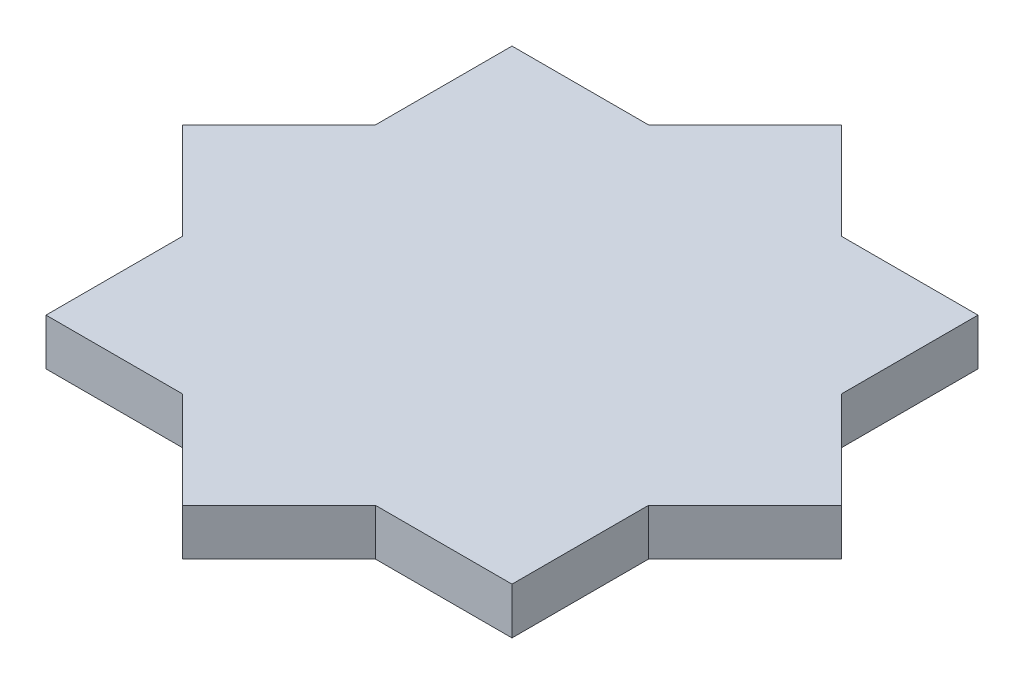
ISO-10303-21;
HEADER;
FILE_DESCRIPTION(('STEP AP214'),'2;1');
FILE_NAME('part.step','',(''),(''),'','','');
FILE_SCHEMA(('AUTOMOTIVE_DESIGN { 1 0 10303 214 1 1 1 1 }'));
ENDSEC;
DATA;
#1=APPLICATION_CONTEXT('core data for automotive mechanical design processes');
#2=APPLICATION_PROTOCOL_DEFINITION('international standard','automotive_design',2000,#1);
#3=PRODUCT_CONTEXT('',#1,'mechanical');
#4=PRODUCT('Part','Part','',(#3));
#5=PRODUCT_RELATED_PRODUCT_CATEGORY('part','',(#4));
#6=PRODUCT_DEFINITION_FORMATION('','',#4);
#7=PRODUCT_DEFINITION_CONTEXT('part definition',#1,'design');
#8=PRODUCT_DEFINITION('design','',#6,#7);
#9=PRODUCT_DEFINITION_SHAPE('','',#8);
#10=(LENGTH_UNIT() NAMED_UNIT(*) SI_UNIT(.MILLI.,.METRE.));
#11=(NAMED_UNIT(*) PLANE_ANGLE_UNIT() SI_UNIT($,.RADIAN.));
#12=(NAMED_UNIT(*) SI_UNIT($,.STERADIAN.) SOLID_ANGLE_UNIT());
#13=UNCERTAINTY_MEASURE_WITH_UNIT(LENGTH_MEASURE(1.E-05),#10,'distance_accuracy_value','');
#14=(GEOMETRIC_REPRESENTATION_CONTEXT(3) GLOBAL_UNCERTAINTY_ASSIGNED_CONTEXT((#13)) GLOBAL_UNIT_ASSIGNED_CONTEXT((#10,
#11,#12)) REPRESENTATION_CONTEXT('',''));
#15=CARTESIAN_POINT('',(0.,0.,0.));
#16=DIRECTION('',(0.,0.,1.));
#17=DIRECTION('',(1.,0.,0.));
#18=AXIS2_PLACEMENT_3D('',#15,#16,#17);
#19=CARTESIAN_POINT('',(0.,3.,21.2132034355964));
#20=DIRECTION('',(-0.707106781186548,0.,-0.707106781186547));
#21=DIRECTION('',(-0.707106781186547,0.,0.707106781186548));
#22=AXIS2_PLACEMENT_3D('',#19,#20,#21);
#23=PLANE('',#22);
#24=DIRECTION('',(0.,-1.,0.));
#25=VECTOR('',#24,1.);
#26=CARTESIAN_POINT('',(6.21320343559643,3.,15.));
#27=LINE('',#26,#25);
#28=CARTESIAN_POINT('',(6.21320343559643,3.,15.));
#29=VERTEX_POINT('',#28);
#30=CARTESIAN_POINT('',(6.21320343559643,0.,15.));
#31=VERTEX_POINT('',#30);
#32=EDGE_CURVE('E193',#29,#31,#27,.T.);
#33=ORIENTED_EDGE('',*,*,#32,.F.);
#34=DIRECTION('',(0.707106781186547,0.,-0.707106781186548));
#35=VECTOR('',#34,1.);
#36=CARTESIAN_POINT('',(0.,3.,21.2132034355964));
#37=LINE('',#36,#35);
#38=CARTESIAN_POINT('',(0.,3.,21.2132034355964));
#39=VERTEX_POINT('',#38);
#40=EDGE_CURVE('E201',#39,#29,#37,.T.);
#41=ORIENTED_EDGE('',*,*,#40,.F.);
#42=DIRECTION('',(0.,-1.,0.));
#43=VECTOR('',#42,1.);
#44=CARTESIAN_POINT('',(0.,3.,21.2132034355964));
#45=LINE('',#44,#43);
#46=CARTESIAN_POINT('',(0.,0.,21.2132034355964));
#47=VERTEX_POINT('',#46);
#48=EDGE_CURVE('E213',#39,#47,#45,.T.);
#49=ORIENTED_EDGE('',*,*,#48,.T.);
#50=DIRECTION('',(0.707106781186547,0.,-0.707106781186548));
#51=VECTOR('',#50,1.);
#52=CARTESIAN_POINT('',(0.,0.,21.2132034355964));
#53=LINE('',#52,#51);
#54=EDGE_CURVE('E214',#47,#31,#53,.T.);
#55=ORIENTED_EDGE('',*,*,#54,.T.);
#56=EDGE_LOOP('',(#33,#41,#49,#55));
#57=FACE_BOUND('',#56,.T.);
#58=ADVANCED_FACE('F35',(#57),#23,.F.);
#59=DIRECTION('',(0.,1.,0.));
#60=VECTOR('',#59,1.);
#61=CARTESIAN_POINT('',(15.,3.,6.21320343559643));
#62=LINE('',#61,#60);
#63=CARTESIAN_POINT('',(15.,0.,6.21320343559643));
#64=VERTEX_POINT('',#63);
#65=CARTESIAN_POINT('',(15.,3.,6.21320343559643));
#66=VERTEX_POINT('',#65);
#67=EDGE_CURVE('E189',#64,#66,#62,.T.);
#68=ORIENTED_EDGE('',*,*,#67,.F.);
#69=CARTESIAN_POINT('',(21.2132034355964,0.,0.));
#70=VERTEX_POINT('',#69);
#71=EDGE_CURVE('E200',#64,#70,#53,.T.);
#72=ORIENTED_EDGE('',*,*,#71,.T.);
#73=DIRECTION('',(0.,-1.,0.));
#74=VECTOR('',#73,1.);
#75=CARTESIAN_POINT('',(21.2132034355964,3.,0.));
#76=LINE('',#75,#74);
#77=CARTESIAN_POINT('',(21.2132034355964,3.,0.));
#78=VERTEX_POINT('',#77);
#79=EDGE_CURVE('E11',#78,#70,#76,.T.);
#80=ORIENTED_EDGE('',*,*,#79,.F.);
#81=EDGE_CURVE('E205',#66,#78,#37,.T.);
#82=ORIENTED_EDGE('',*,*,#81,.F.);
#83=EDGE_LOOP('',(#68,#72,#80,#82));
#84=FACE_BOUND('',#83,.T.);
#85=ADVANCED_FACE('F290',(#84),#23,.F.);
#86=CARTESIAN_POINT('',(0.,3.,-21.2132034355964));
#87=DIRECTION('',(-0.707106781186548,0.,0.707106781186547));
#88=DIRECTION('',(0.707106781186547,0.,0.707106781186548));
#89=AXIS2_PLACEMENT_3D('',#86,#87,#88);
#90=PLANE('',#89);
#91=DIRECTION('',(0.,-1.,0.));
#92=VECTOR('',#91,1.);
#93=CARTESIAN_POINT('',(15.,3.,-6.21320343559643));
#94=LINE('',#93,#92);
#95=CARTESIAN_POINT('',(15.,3.,-6.21320343559643));
#96=VERTEX_POINT('',#95);
#97=CARTESIAN_POINT('',(15.,0.,-6.21320343559643));
#98=VERTEX_POINT('',#97);
#99=EDGE_CURVE('E186',#96,#98,#94,.T.);
#100=ORIENTED_EDGE('',*,*,#99,.F.);
#101=DIRECTION('',(-0.707106781186547,0.,-0.707106781186548));
#102=VECTOR('',#101,1.);
#103=CARTESIAN_POINT('',(0.,3.,-21.2132034355964));
#104=LINE('',#103,#102);
#105=EDGE_CURVE('E206',#78,#96,#104,.T.);
#106=ORIENTED_EDGE('',*,*,#105,.F.);
#107=ORIENTED_EDGE('',*,*,#79,.T.);
#108=DIRECTION('',(-0.707106781186547,0.,-0.707106781186548));
#109=VECTOR('',#108,1.);
#110=CARTESIAN_POINT('',(0.,0.,-21.2132034355964));
#111=LINE('',#110,#109);
#112=EDGE_CURVE('E217',#70,#98,#111,.T.);
#113=ORIENTED_EDGE('',*,*,#112,.T.);
#114=EDGE_LOOP('',(#100,#106,#107,#113));
#115=FACE_BOUND('',#114,.T.);
#116=ADVANCED_FACE('F294',(#115),#90,.F.);
#117=DIRECTION('',(0.,1.,0.));
#118=VECTOR('',#117,1.);
#119=CARTESIAN_POINT('',(6.21320343559644,3.,-15.));
#120=LINE('',#119,#118);
#121=CARTESIAN_POINT('',(6.21320343559643,0.,-15.));
#122=VERTEX_POINT('',#121);
#123=CARTESIAN_POINT('',(6.21320343559644,3.,-15.));
#124=VERTEX_POINT('',#123);
#125=EDGE_CURVE('E177',#122,#124,#120,.T.);
#126=ORIENTED_EDGE('',*,*,#125,.F.);
#127=CARTESIAN_POINT('',(0.,0.,-21.2132034355964));
#128=VERTEX_POINT('',#127);
#129=EDGE_CURVE('E216',#122,#128,#111,.T.);
#130=ORIENTED_EDGE('',*,*,#129,.T.);
#131=DIRECTION('',(0.,-1.,0.));
#132=VECTOR('',#131,1.);
#133=CARTESIAN_POINT('',(0.,3.,-21.2132034355964));
#134=LINE('',#133,#132);
#135=CARTESIAN_POINT('',(0.,3.,-21.2132034355964));
#136=VERTEX_POINT('',#135);
#137=EDGE_CURVE('E42',#136,#128,#134,.T.);
#138=ORIENTED_EDGE('',*,*,#137,.F.);
#139=EDGE_CURVE('E204',#124,#136,#104,.T.);
#140=ORIENTED_EDGE('',*,*,#139,.F.);
#141=EDGE_LOOP('',(#126,#130,#138,#140));
#142=FACE_BOUND('',#141,.T.);
#143=ADVANCED_FACE('F297',(#142),#90,.F.);
#144=CARTESIAN_POINT('',(-21.2132034355964,3.,0.));
#145=DIRECTION('',(0.707106781186548,0.,0.707106781186547));
#146=DIRECTION('',(0.707106781186547,0.,-0.707106781186548));
#147=AXIS2_PLACEMENT_3D('',#144,#145,#146);
#148=PLANE('',#147);
#149=DIRECTION('',(0.,1.,0.));
#150=VECTOR('',#149,1.);
#151=CARTESIAN_POINT('',(-15.,3.,-6.21320343559643));
#152=LINE('',#151,#150);
#153=CARTESIAN_POINT('',(-15.,0.,-6.21320343559643));
#154=VERTEX_POINT('',#153);
#155=CARTESIAN_POINT('',(-15.,3.,-6.21320343559643));
#156=VERTEX_POINT('',#155);
#157=EDGE_CURVE('E197',#154,#156,#152,.T.);
#158=ORIENTED_EDGE('',*,*,#157,.F.);
#159=DIRECTION('',(-0.707106781186547,0.,0.707106781186548));
#160=VECTOR('',#159,1.);
#161=CARTESIAN_POINT('',(-21.2132034355964,0.,0.));
#162=LINE('',#161,#160);
#163=CARTESIAN_POINT('',(-21.2132034355964,0.,0.));
#164=VERTEX_POINT('',#163);
#165=EDGE_CURVE('E219',#154,#164,#162,.T.);
#166=ORIENTED_EDGE('',*,*,#165,.T.);
#167=DIRECTION('',(0.,-1.,0.));
#168=VECTOR('',#167,1.);
#169=CARTESIAN_POINT('',(-21.2132034355964,3.,0.));
#170=LINE('',#169,#168);
#171=CARTESIAN_POINT('',(-21.2132034355964,3.,0.));
#172=VERTEX_POINT('',#171);
#173=EDGE_CURVE('E227',#172,#164,#170,.T.);
#174=ORIENTED_EDGE('',*,*,#173,.F.);
#175=DIRECTION('',(-0.707106781186547,0.,0.707106781186548));
#176=VECTOR('',#175,1.);
#177=CARTESIAN_POINT('',(-21.2132034355964,3.,0.));
#178=LINE('',#177,#176);
#179=EDGE_CURVE('E209',#156,#172,#178,.T.);
#180=ORIENTED_EDGE('',*,*,#179,.F.);
#181=EDGE_LOOP('',(#158,#166,#174,#180));
#182=FACE_BOUND('',#181,.T.);
#183=ADVANCED_FACE('F299',(#182),#148,.F.);
#184=DIRECTION('',(0.,-1.,0.));
#185=VECTOR('',#184,1.);
#186=CARTESIAN_POINT('',(-6.21320343559643,3.,-15.));
#187=LINE('',#186,#185);
#188=CARTESIAN_POINT('',(-6.21320343559643,3.,-15.));
#189=VERTEX_POINT('',#188);
#190=CARTESIAN_POINT('',(-6.21320343559643,0.,-15.));
#191=VERTEX_POINT('',#190);
#192=EDGE_CURVE('E173',#189,#191,#187,.T.);
#193=ORIENTED_EDGE('',*,*,#192,.F.);
#194=EDGE_CURVE('E210',#136,#189,#178,.T.);
#195=ORIENTED_EDGE('',*,*,#194,.F.);
#196=ORIENTED_EDGE('',*,*,#137,.T.);
#197=EDGE_CURVE('E220',#128,#191,#162,.T.);
#198=ORIENTED_EDGE('',*,*,#197,.T.);
#199=EDGE_LOOP('',(#193,#195,#196,#198));
#200=FACE_BOUND('',#199,.T.);
#201=ADVANCED_FACE('F234',(#200),#148,.F.);
#202=CARTESIAN_POINT('',(-21.2132034355964,3.,0.));
#203=DIRECTION('',(0.707106781186548,0.,-0.707106781186548));
#204=DIRECTION('',(-0.707106781186548,0.,-0.707106781186548));
#205=AXIS2_PLACEMENT_3D('',#202,#203,#204);
#206=PLANE('',#205);
#207=DIRECTION('',(0.,-1.,0.));
#208=VECTOR('',#207,1.);
#209=CARTESIAN_POINT('',(-15.,3.,6.21320343559642));
#210=LINE('',#209,#208);
#211=CARTESIAN_POINT('',(-15.,3.,6.21320343559643));
#212=VERTEX_POINT('',#211);
#213=CARTESIAN_POINT('',(-15.,0.,6.21320343559643));
#214=VERTEX_POINT('',#213);
#215=EDGE_CURVE('E57',#212,#214,#210,.T.);
#216=ORIENTED_EDGE('',*,*,#215,.F.);
#217=DIRECTION('',(0.707106781186547,0.,0.707106781186547));
#218=VECTOR('',#217,1.);
#219=CARTESIAN_POINT('',(-21.2132034355964,3.,0.));
#220=LINE('',#219,#218);
#221=EDGE_CURVE('E154',#172,#212,#220,.T.);
#222=ORIENTED_EDGE('',*,*,#221,.F.);
#223=ORIENTED_EDGE('',*,*,#173,.T.);
#224=DIRECTION('',(0.707106781186547,0.,0.707106781186547));
#225=VECTOR('',#224,1.);
#226=CARTESIAN_POINT('',(-21.2132034355964,0.,0.));
#227=LINE('',#226,#225);
#228=EDGE_CURVE('E223',#164,#214,#227,.T.);
#229=ORIENTED_EDGE('',*,*,#228,.T.);
#230=EDGE_LOOP('',(#216,#222,#223,#229));
#231=FACE_BOUND('',#230,.T.);
#232=ADVANCED_FACE('F314',(#231),#206,.F.);
#233=DIRECTION('',(0.,1.,0.));
#234=VECTOR('',#233,1.);
#235=CARTESIAN_POINT('',(-6.21320343559643,3.,15.));
#236=LINE('',#235,#234);
#237=CARTESIAN_POINT('',(-6.21320343559643,0.,15.));
#238=VERTEX_POINT('',#237);
#239=CARTESIAN_POINT('',(-6.21320343559643,3.,15.));
#240=VERTEX_POINT('',#239);
#241=EDGE_CURVE('E165',#238,#240,#236,.T.);
#242=ORIENTED_EDGE('',*,*,#241,.F.);
#243=EDGE_CURVE('E222',#238,#47,#227,.T.);
#244=ORIENTED_EDGE('',*,*,#243,.T.);
#245=ORIENTED_EDGE('',*,*,#48,.F.);
#246=EDGE_CURVE('E49',#240,#39,#220,.T.);
#247=ORIENTED_EDGE('',*,*,#246,.F.);
#248=EDGE_LOOP('',(#242,#244,#245,#247));
#249=FACE_BOUND('',#248,.T.);
#250=ADVANCED_FACE('F312',(#249),#206,.F.);
#251=CARTESIAN_POINT('',(0.,3.,0.));
#252=DIRECTION('',(0.,-1.,0.));
#253=DIRECTION('',(0.,0.,-1.));
#254=AXIS2_PLACEMENT_3D('',#251,#252,#253);
#255=PLANE('',#254);
#256=ORIENTED_EDGE('',*,*,#194,.T.);
#257=DIRECTION('',(-1.,0.,0.));
#258=VECTOR('',#257,1.);
#259=CARTESIAN_POINT('',(-15.,3.,-15.));
#260=LINE('',#259,#258);
#261=CARTESIAN_POINT('',(-15.,3.,-15.));
#262=VERTEX_POINT('',#261);
#263=EDGE_CURVE('E273',#189,#262,#260,.T.);
#264=ORIENTED_EDGE('',*,*,#263,.T.);
#265=DIRECTION('',(0.,0.,1.));
#266=VECTOR('',#265,1.);
#267=CARTESIAN_POINT('',(-15.,3.,-15.));
#268=LINE('',#267,#266);
#269=EDGE_CURVE('E157',#262,#156,#268,.T.);
#270=ORIENTED_EDGE('',*,*,#269,.T.);
#271=ORIENTED_EDGE('',*,*,#179,.T.);
#272=ORIENTED_EDGE('',*,*,#221,.T.);
#273=CARTESIAN_POINT('',(-15.,3.,15.));
#274=VERTEX_POINT('',#273);
#275=EDGE_CURVE('E149',#212,#274,#268,.T.);
#276=ORIENTED_EDGE('',*,*,#275,.T.);
#277=DIRECTION('',(1.,0.,0.));
#278=VECTOR('',#277,1.);
#279=CARTESIAN_POINT('',(-15.,3.,15.));
#280=LINE('',#279,#278);
#281=EDGE_CURVE('E153',#274,#240,#280,.T.);
#282=ORIENTED_EDGE('',*,*,#281,.T.);
#283=ORIENTED_EDGE('',*,*,#246,.T.);
#284=ORIENTED_EDGE('',*,*,#40,.T.);
#285=CARTESIAN_POINT('',(15.,3.,15.));
#286=VERTEX_POINT('',#285);
#287=EDGE_CURVE('E167',#29,#286,#280,.T.);
#288=ORIENTED_EDGE('',*,*,#287,.T.);
#289=DIRECTION('',(0.,0.,-1.));
#290=VECTOR('',#289,1.);
#291=CARTESIAN_POINT('',(15.,3.,-15.));
#292=LINE('',#291,#290);
#293=EDGE_CURVE('E274',#286,#66,#292,.T.);
#294=ORIENTED_EDGE('',*,*,#293,.T.);
#295=ORIENTED_EDGE('',*,*,#81,.T.);
#296=ORIENTED_EDGE('',*,*,#105,.T.);
#297=CARTESIAN_POINT('',(15.,3.,-15.));
#298=VERTEX_POINT('',#297);
#299=EDGE_CURVE('E166',#96,#298,#292,.T.);
#300=ORIENTED_EDGE('',*,*,#299,.T.);
#301=EDGE_CURVE('E257',#298,#124,#260,.T.);
#302=ORIENTED_EDGE('',*,*,#301,.T.);
#303=ORIENTED_EDGE('',*,*,#139,.T.);
#304=EDGE_LOOP('',(#256,#264,#270,#271,#272,#276,#282,#283,#284,#288,#294,#295,#296,#300,#302,#303));
#305=FACE_BOUND('',#304,.T.);
#306=ADVANCED_FACE('F152',(#305),#255,.F.);
#307=CARTESIAN_POINT('',(0.,0.,0.));
#308=DIRECTION('',(0.,-1.,0.));
#309=DIRECTION('',(0.,0.,-1.));
#310=AXIS2_PLACEMENT_3D('',#307,#308,#309);
#311=PLANE('',#310);
#312=ORIENTED_EDGE('',*,*,#243,.F.);
#313=DIRECTION('',(1.,0.,0.));
#314=VECTOR('',#313,1.);
#315=CARTESIAN_POINT('',(-15.,0.,15.));
#316=LINE('',#315,#314);
#317=CARTESIAN_POINT('',(-15.,0.,15.));
#318=VERTEX_POINT('',#317);
#319=EDGE_CURVE('E268',#318,#238,#316,.T.);
#320=ORIENTED_EDGE('',*,*,#319,.F.);
#321=DIRECTION('',(0.,0.,1.));
#322=VECTOR('',#321,1.);
#323=CARTESIAN_POINT('',(-15.,0.,-15.));
#324=LINE('',#323,#322);
#325=EDGE_CURVE('E171',#214,#318,#324,.T.);
#326=ORIENTED_EDGE('',*,*,#325,.F.);
#327=ORIENTED_EDGE('',*,*,#228,.F.);
#328=ORIENTED_EDGE('',*,*,#165,.F.);
#329=CARTESIAN_POINT('',(-15.,0.,-15.));
#330=VERTEX_POINT('',#329);
#331=EDGE_CURVE('E244',#330,#154,#324,.T.);
#332=ORIENTED_EDGE('',*,*,#331,.F.);
#333=DIRECTION('',(-1.,0.,0.));
#334=VECTOR('',#333,1.);
#335=CARTESIAN_POINT('',(-15.,0.,-15.));
#336=LINE('',#335,#334);
#337=EDGE_CURVE('E242',#191,#330,#336,.T.);
#338=ORIENTED_EDGE('',*,*,#337,.F.);
#339=ORIENTED_EDGE('',*,*,#197,.F.);
#340=ORIENTED_EDGE('',*,*,#129,.F.);
#341=CARTESIAN_POINT('',(15.,0.,-15.));
#342=VERTEX_POINT('',#341);
#343=EDGE_CURVE('E158',#342,#122,#336,.T.);
#344=ORIENTED_EDGE('',*,*,#343,.F.);
#345=DIRECTION('',(0.,0.,-1.));
#346=VECTOR('',#345,1.);
#347=CARTESIAN_POINT('',(15.,0.,-15.));
#348=LINE('',#347,#346);
#349=EDGE_CURVE('E252',#98,#342,#348,.T.);
#350=ORIENTED_EDGE('',*,*,#349,.F.);
#351=ORIENTED_EDGE('',*,*,#112,.F.);
#352=ORIENTED_EDGE('',*,*,#71,.F.);
#353=CARTESIAN_POINT('',(15.,0.,15.));
#354=VERTEX_POINT('',#353);
#355=EDGE_CURVE('E248',#354,#64,#348,.T.);
#356=ORIENTED_EDGE('',*,*,#355,.F.);
#357=EDGE_CURVE('E269',#31,#354,#316,.T.);
#358=ORIENTED_EDGE('',*,*,#357,.F.);
#359=ORIENTED_EDGE('',*,*,#54,.F.);
#360=EDGE_LOOP('',(#312,#320,#326,#327,#328,#332,#338,#339,#340,#344,#350,#351,#352,#356,#358,#359));
#361=FACE_BOUND('',#360,.T.);
#362=ADVANCED_FACE('F238',(#361),#311,.T.);
#363=CARTESIAN_POINT('',(-15.,3.,15.));
#364=DIRECTION('',(0.,0.,-1.));
#365=DIRECTION('',(-1.,0.,0.));
#366=AXIS2_PLACEMENT_3D('',#363,#364,#365);
#367=PLANE('',#366);
#368=ORIENTED_EDGE('',*,*,#319,.T.);
#369=ORIENTED_EDGE('',*,*,#241,.T.);
#370=ORIENTED_EDGE('',*,*,#281,.F.);
#371=DIRECTION('',(0.,-1.,0.));
#372=VECTOR('',#371,1.);
#373=CARTESIAN_POINT('',(-15.,3.,15.));
#374=LINE('',#373,#372);
#375=EDGE_CURVE('E164',#274,#318,#374,.T.);
#376=ORIENTED_EDGE('',*,*,#375,.T.);
#377=EDGE_LOOP('',(#368,#369,#370,#376));
#378=FACE_BOUND('',#377,.T.);
#379=ADVANCED_FACE('F163',(#378),#367,.F.);
#380=CARTESIAN_POINT('',(-15.,3.,-15.));
#381=DIRECTION('',(1.,0.,0.));
#382=DIRECTION('',(0.,0.,-1.));
#383=AXIS2_PLACEMENT_3D('',#380,#381,#382);
#384=PLANE('',#383);
#385=ORIENTED_EDGE('',*,*,#275,.F.);
#386=ORIENTED_EDGE('',*,*,#215,.T.);
#387=ORIENTED_EDGE('',*,*,#325,.T.);
#388=ORIENTED_EDGE('',*,*,#375,.F.);
#389=EDGE_LOOP('',(#385,#386,#387,#388));
#390=FACE_BOUND('',#389,.T.);
#391=ADVANCED_FACE('F169',(#390),#384,.F.);
#392=CARTESIAN_POINT('',(-15.,3.,-15.));
#393=DIRECTION('',(0.,0.,1.));
#394=DIRECTION('',(1.,0.,0.));
#395=AXIS2_PLACEMENT_3D('',#392,#393,#394);
#396=PLANE('',#395);
#397=ORIENTED_EDGE('',*,*,#263,.F.);
#398=ORIENTED_EDGE('',*,*,#192,.T.);
#399=ORIENTED_EDGE('',*,*,#337,.T.);
#400=DIRECTION('',(0.,-1.,0.));
#401=VECTOR('',#400,1.);
#402=CARTESIAN_POINT('',(-15.,3.,-15.));
#403=LINE('',#402,#401);
#404=EDGE_CURVE('E256',#262,#330,#403,.T.);
#405=ORIENTED_EDGE('',*,*,#404,.F.);
#406=EDGE_LOOP('',(#397,#398,#399,#405));
#407=FACE_BOUND('',#406,.T.);
#408=ADVANCED_FACE('F327',(#407),#396,.F.);
#409=ORIENTED_EDGE('',*,*,#331,.T.);
#410=ORIENTED_EDGE('',*,*,#157,.T.);
#411=ORIENTED_EDGE('',*,*,#269,.F.);
#412=ORIENTED_EDGE('',*,*,#404,.T.);
#413=EDGE_LOOP('',(#409,#410,#411,#412));
#414=FACE_BOUND('',#413,.T.);
#415=ADVANCED_FACE('F324',(#414),#384,.F.);
#416=ORIENTED_EDGE('',*,*,#343,.T.);
#417=ORIENTED_EDGE('',*,*,#125,.T.);
#418=ORIENTED_EDGE('',*,*,#301,.F.);
#419=DIRECTION('',(0.,-1.,0.));
#420=VECTOR('',#419,1.);
#421=CARTESIAN_POINT('',(15.,3.,-15.));
#422=LINE('',#421,#420);
#423=EDGE_CURVE('E180',#298,#342,#422,.T.);
#424=ORIENTED_EDGE('',*,*,#423,.T.);
#425=EDGE_LOOP('',(#416,#417,#418,#424));
#426=FACE_BOUND('',#425,.T.);
#427=ADVANCED_FACE('F262',(#426),#396,.F.);
#428=CARTESIAN_POINT('',(15.,3.,-15.));
#429=DIRECTION('',(-1.,0.,0.));
#430=DIRECTION('',(0.,0.,1.));
#431=AXIS2_PLACEMENT_3D('',#428,#429,#430);
#432=PLANE('',#431);
#433=ORIENTED_EDGE('',*,*,#299,.F.);
#434=ORIENTED_EDGE('',*,*,#99,.T.);
#435=ORIENTED_EDGE('',*,*,#349,.T.);
#436=ORIENTED_EDGE('',*,*,#423,.F.);
#437=EDGE_LOOP('',(#433,#434,#435,#436));
#438=FACE_BOUND('',#437,.T.);
#439=ADVANCED_FACE('F295',(#438),#432,.F.);
#440=ORIENTED_EDGE('',*,*,#287,.F.);
#441=ORIENTED_EDGE('',*,*,#32,.T.);
#442=ORIENTED_EDGE('',*,*,#357,.T.);
#443=DIRECTION('',(0.,-1.,0.));
#444=VECTOR('',#443,1.);
#445=CARTESIAN_POINT('',(15.,3.,15.));
#446=LINE('',#445,#444);
#447=EDGE_CURVE('E174',#286,#354,#446,.T.);
#448=ORIENTED_EDGE('',*,*,#447,.F.);
#449=EDGE_LOOP('',(#440,#441,#442,#448));
#450=FACE_BOUND('',#449,.T.);
#451=ADVANCED_FACE('F283',(#450),#367,.F.);
#452=ORIENTED_EDGE('',*,*,#355,.T.);
#453=ORIENTED_EDGE('',*,*,#67,.T.);
#454=ORIENTED_EDGE('',*,*,#293,.F.);
#455=ORIENTED_EDGE('',*,*,#447,.T.);
#456=EDGE_LOOP('',(#452,#453,#454,#455));
#457=FACE_BOUND('',#456,.T.);
#458=ADVANCED_FACE('F287',(#457),#432,.F.);
#459=CLOSED_SHELL('',(#58,#85,#116,#143,#183,#201,#232,#250,#306,#362,#379,#391,#408,#415,#427,
#439,#451,#458));
#460=MANIFOLD_SOLID_BREP('B2',#459);
#461=ADVANCED_BREP_SHAPE_REPRESENTATION('',(#18,#460),#14);
#462=SHAPE_DEFINITION_REPRESENTATION(#9,#461);
ENDSEC;
END-ISO-10303-21;
